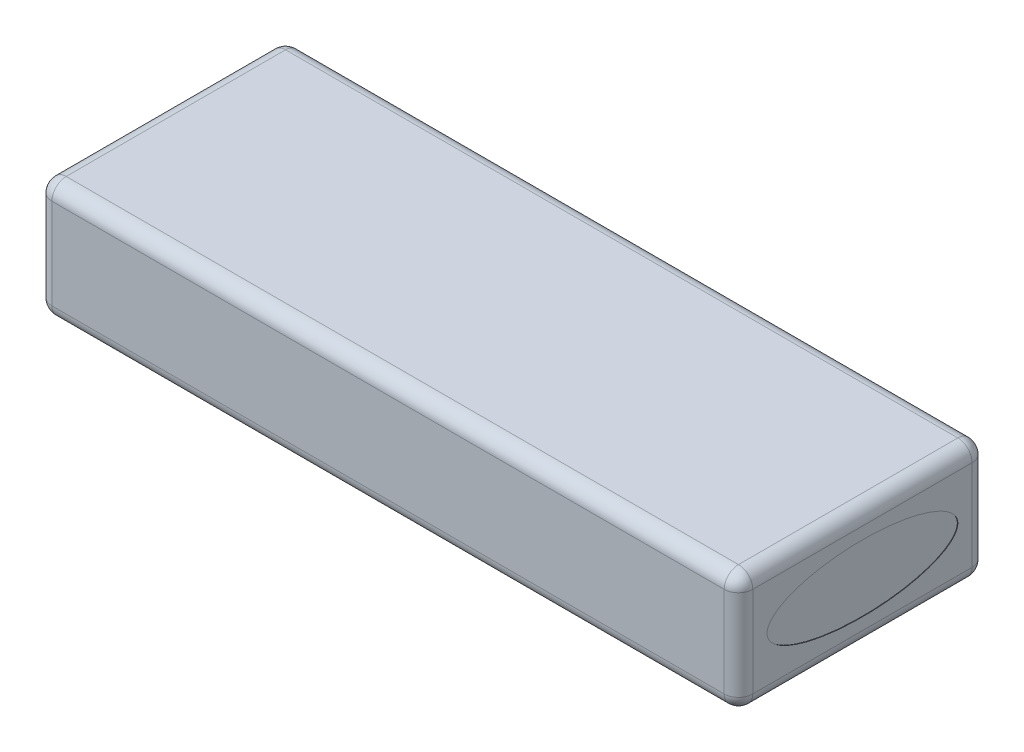
ISO-10303-21;
HEADER;
FILE_DESCRIPTION(('STEP AP214'),'2;1');
FILE_NAME('part.step','',(''),(''),'','','');
FILE_SCHEMA(('AUTOMOTIVE_DESIGN { 1 0 10303 214 1 1 1 1 }'));
ENDSEC;
DATA;
#1=APPLICATION_CONTEXT('core data for automotive mechanical design processes');
#2=APPLICATION_PROTOCOL_DEFINITION('international standard','automotive_design',2000,#1);
#3=PRODUCT_CONTEXT('',#1,'mechanical');
#4=PRODUCT('Part','Part','',(#3));
#5=PRODUCT_RELATED_PRODUCT_CATEGORY('part','',(#4));
#6=PRODUCT_DEFINITION_FORMATION('','',#4);
#7=PRODUCT_DEFINITION_CONTEXT('part definition',#1,'design');
#8=PRODUCT_DEFINITION('design','',#6,#7);
#9=PRODUCT_DEFINITION_SHAPE('','',#8);
#10=(LENGTH_UNIT() NAMED_UNIT(*) SI_UNIT(.MILLI.,.METRE.));
#11=(NAMED_UNIT(*) PLANE_ANGLE_UNIT() SI_UNIT($,.RADIAN.));
#12=(NAMED_UNIT(*) SI_UNIT($,.STERADIAN.) SOLID_ANGLE_UNIT());
#13=UNCERTAINTY_MEASURE_WITH_UNIT(LENGTH_MEASURE(1.E-05),#10,'distance_accuracy_value','');
#14=(GEOMETRIC_REPRESENTATION_CONTEXT(3) GLOBAL_UNCERTAINTY_ASSIGNED_CONTEXT((#13)) GLOBAL_UNIT_ASSIGNED_CONTEXT((#10,
#11,#12)) REPRESENTATION_CONTEXT('',''));
#15=CARTESIAN_POINT('',(0.,0.,0.));
#16=DIRECTION('',(0.,0.,1.));
#17=DIRECTION('',(1.,0.,0.));
#18=AXIS2_PLACEMENT_3D('',#15,#16,#17);
#19=CARTESIAN_POINT('',(73.5,-12.5,26.));
#20=DIRECTION('',(1.,0.,0.));
#21=DIRECTION('',(0.,0.,-1.));
#22=AXIS2_PLACEMENT_3D('',#19,#20,#21);
#23=PLANE('',#22);
#24=CARTESIAN_POINT('',(73.5,0.,0.));
#25=DIRECTION('',(1.,0.,0.));
#26=DIRECTION('',(0.,0.,-1.));
#27=AXIS2_PLACEMENT_3D('',#24,#25,#26);
#28=ELLIPSE('',#27,20.,7.);
#29=CARTESIAN_POINT('',(73.5,0.,-20.));
#30=VERTEX_POINT('',#29);
#31=EDGE_CURVE('E628',#30,#30,#28,.T.);
#32=ORIENTED_EDGE('',*,*,#31,.F.);
#33=EDGE_LOOP('',(#32));
#34=FACE_BOUND('',#33,.T.);
#35=DIRECTION('',(0.,0.,-1.));
#36=VECTOR('',#35,1.);
#37=CARTESIAN_POINT('',(73.5,9.5,23.));
#38=LINE('',#37,#36);
#39=CARTESIAN_POINT('',(73.5,9.5,-23.));
#40=VERTEX_POINT('',#39);
#41=CARTESIAN_POINT('',(73.5,9.5,23.));
#42=VERTEX_POINT('',#41);
#43=EDGE_CURVE('E45',#40,#42,#38,.F.);
#44=ORIENTED_EDGE('',*,*,#43,.T.);
#45=DIRECTION('',(0.,1.,0.));
#46=VECTOR('',#45,1.);
#47=CARTESIAN_POINT('',(73.5,-12.5,23.));
#48=LINE('',#47,#46);
#49=CARTESIAN_POINT('',(73.5,-9.5,23.));
#50=VERTEX_POINT('',#49);
#51=EDGE_CURVE('E11',#42,#50,#48,.F.);
#52=ORIENTED_EDGE('',*,*,#51,.T.);
#53=DIRECTION('',(0.,0.,-1.));
#54=VECTOR('',#53,1.);
#55=CARTESIAN_POINT('',(73.5,-9.5,26.));
#56=LINE('',#55,#54);
#57=CARTESIAN_POINT('',(73.5,-9.5,-23.));
#58=VERTEX_POINT('',#57);
#59=EDGE_CURVE('E135',#50,#58,#56,.T.);
#60=ORIENTED_EDGE('',*,*,#59,.T.);
#61=DIRECTION('',(0.,1.,0.));
#62=VECTOR('',#61,1.);
#63=CARTESIAN_POINT('',(73.5,-12.5,-23.));
#64=LINE('',#63,#62);
#65=EDGE_CURVE('E56',#58,#40,#64,.T.);
#66=ORIENTED_EDGE('',*,*,#65,.T.);
#67=EDGE_LOOP('',(#44,#52,#60,#66));
#68=FACE_BOUND('',#67,.T.);
#69=ADVANCED_FACE('F36',(#34,#68),#23,.T.);
#70=CARTESIAN_POINT('',(-73.5,-12.5,26.));
#71=DIRECTION('',(0.,0.,1.));
#72=DIRECTION('',(1.,0.,0.));
#73=AXIS2_PLACEMENT_3D('',#70,#71,#72);
#74=PLANE('',#73);
#75=DIRECTION('',(1.,0.,0.));
#76=VECTOR('',#75,1.);
#77=CARTESIAN_POINT('',(-73.5,9.5,26.));
#78=LINE('',#77,#76);
#79=CARTESIAN_POINT('',(70.5,9.5,26.));
#80=VERTEX_POINT('',#79);
#81=CARTESIAN_POINT('',(-70.5,9.5,26.));
#82=VERTEX_POINT('',#81);
#83=EDGE_CURVE('E185',#80,#82,#78,.F.);
#84=ORIENTED_EDGE('',*,*,#83,.T.);
#85=DIRECTION('',(0.,1.,0.));
#86=VECTOR('',#85,1.);
#87=CARTESIAN_POINT('',(-70.5,-12.5,26.));
#88=LINE('',#87,#86);
#89=CARTESIAN_POINT('',(-70.5,-9.5,26.));
#90=VERTEX_POINT('',#89);
#91=EDGE_CURVE('E261',#82,#90,#88,.F.);
#92=ORIENTED_EDGE('',*,*,#91,.T.);
#93=DIRECTION('',(1.,0.,0.));
#94=VECTOR('',#93,1.);
#95=CARTESIAN_POINT('',(-73.5,-9.5,26.));
#96=LINE('',#95,#94);
#97=CARTESIAN_POINT('',(70.5,-9.5,26.));
#98=VERTEX_POINT('',#97);
#99=EDGE_CURVE('E148',#90,#98,#96,.T.);
#100=ORIENTED_EDGE('',*,*,#99,.T.);
#101=DIRECTION('',(0.,1.,0.));
#102=VECTOR('',#101,1.);
#103=CARTESIAN_POINT('',(70.5,-12.5,26.));
#104=LINE('',#103,#102);
#105=EDGE_CURVE('E259',#98,#80,#104,.T.);
#106=ORIENTED_EDGE('',*,*,#105,.T.);
#107=EDGE_LOOP('',(#84,#92,#100,#106));
#108=FACE_BOUND('',#107,.T.);
#109=ADVANCED_FACE('F288',(#108),#74,.T.);
#110=CARTESIAN_POINT('',(-73.5,-12.5,26.));
#111=DIRECTION('',(-1.,0.,0.));
#112=DIRECTION('',(0.,0.,1.));
#113=AXIS2_PLACEMENT_3D('',#110,#111,#112);
#114=PLANE('',#113);
#115=CARTESIAN_POINT('',(-73.5,0.,0.));
#116=DIRECTION('',(-1.,0.,0.));
#117=DIRECTION('',(0.,0.,-1.));
#118=AXIS2_PLACEMENT_3D('',#115,#116,#117);
#119=ELLIPSE('',#118,20.,7.);
#120=CARTESIAN_POINT('',(-73.5,0.,-20.));
#121=VERTEX_POINT('',#120);
#122=EDGE_CURVE('E629',#121,#121,#119,.T.);
#123=ORIENTED_EDGE('',*,*,#122,.F.);
#124=EDGE_LOOP('',(#123));
#125=FACE_BOUND('',#124,.T.);
#126=DIRECTION('',(0.,0.,1.));
#127=VECTOR('',#126,1.);
#128=CARTESIAN_POINT('',(-73.5,9.5,-23.));
#129=LINE('',#128,#127);
#130=CARTESIAN_POINT('',(-73.5,9.5,23.));
#131=VERTEX_POINT('',#130);
#132=CARTESIAN_POINT('',(-73.5,9.5,-23.));
#133=VERTEX_POINT('',#132);
#134=EDGE_CURVE('E245',#131,#133,#129,.F.);
#135=ORIENTED_EDGE('',*,*,#134,.T.);
#136=DIRECTION('',(0.,1.,0.));
#137=VECTOR('',#136,1.);
#138=CARTESIAN_POINT('',(-73.5,-12.5,-23.));
#139=LINE('',#138,#137);
#140=CARTESIAN_POINT('',(-73.5,-9.5,-23.));
#141=VERTEX_POINT('',#140);
#142=EDGE_CURVE('E247',#133,#141,#139,.F.);
#143=ORIENTED_EDGE('',*,*,#142,.T.);
#144=DIRECTION('',(0.,0.,1.));
#145=VECTOR('',#144,1.);
#146=CARTESIAN_POINT('',(-73.5,-9.5,26.));
#147=LINE('',#146,#145);
#148=CARTESIAN_POINT('',(-73.5,-9.5,23.));
#149=VERTEX_POINT('',#148);
#150=EDGE_CURVE('E160',#141,#149,#147,.T.);
#151=ORIENTED_EDGE('',*,*,#150,.T.);
#152=DIRECTION('',(0.,1.,0.));
#153=VECTOR('',#152,1.);
#154=CARTESIAN_POINT('',(-73.5,-12.5,23.));
#155=LINE('',#154,#153);
#156=EDGE_CURVE('E243',#149,#131,#155,.T.);
#157=ORIENTED_EDGE('',*,*,#156,.T.);
#158=EDGE_LOOP('',(#135,#143,#151,#157));
#159=FACE_BOUND('',#158,.T.);
#160=ADVANCED_FACE('F294',(#125,#159),#114,.T.);
#161=CARTESIAN_POINT('',(-73.5,-12.5,-26.));
#162=DIRECTION('',(0.,0.,-1.));
#163=DIRECTION('',(-1.,0.,0.));
#164=AXIS2_PLACEMENT_3D('',#161,#162,#163);
#165=PLANE('',#164);
#166=DIRECTION('',(-1.,0.,0.));
#167=VECTOR('',#166,1.);
#168=CARTESIAN_POINT('',(-73.5,-9.5,-26.));
#169=LINE('',#168,#167);
#170=CARTESIAN_POINT('',(70.5,-9.5,-26.));
#171=VERTEX_POINT('',#170);
#172=CARTESIAN_POINT('',(-70.5,-9.5,-26.));
#173=VERTEX_POINT('',#172);
#174=EDGE_CURVE('E639',#171,#173,#169,.T.);
#175=ORIENTED_EDGE('',*,*,#174,.T.);
#176=DIRECTION('',(0.,1.,0.));
#177=VECTOR('',#176,1.);
#178=CARTESIAN_POINT('',(-70.5,-12.5,-26.));
#179=LINE('',#178,#177);
#180=CARTESIAN_POINT('',(-70.5,9.5,-26.));
#181=VERTEX_POINT('',#180);
#182=EDGE_CURVE('E240',#173,#181,#179,.T.);
#183=ORIENTED_EDGE('',*,*,#182,.T.);
#184=DIRECTION('',(-1.,0.,0.));
#185=VECTOR('',#184,1.);
#186=CARTESIAN_POINT('',(73.5,9.5,-26.));
#187=LINE('',#186,#185);
#188=CARTESIAN_POINT('',(70.5,9.5,-26.));
#189=VERTEX_POINT('',#188);
#190=EDGE_CURVE('E273',#181,#189,#187,.F.);
#191=ORIENTED_EDGE('',*,*,#190,.T.);
#192=DIRECTION('',(0.,1.,0.));
#193=VECTOR('',#192,1.);
#194=CARTESIAN_POINT('',(70.5,-12.5,-26.));
#195=LINE('',#194,#193);
#196=EDGE_CURVE('E156',#189,#171,#195,.F.);
#197=ORIENTED_EDGE('',*,*,#196,.T.);
#198=EDGE_LOOP('',(#175,#183,#191,#197));
#199=FACE_BOUND('',#198,.T.);
#200=ADVANCED_FACE('F300',(#199),#165,.T.);
#201=CARTESIAN_POINT('',(0.,-12.5,0.));
#202=DIRECTION('',(0.,-1.,0.));
#203=DIRECTION('',(0.,0.,-1.));
#204=AXIS2_PLACEMENT_3D('',#201,#202,#203);
#205=PLANE('',#204);
#206=DIRECTION('',(1.,0.,0.));
#207=VECTOR('',#206,1.);
#208=CARTESIAN_POINT('',(0.,-12.5,23.));
#209=LINE('',#208,#207);
#210=CARTESIAN_POINT('',(70.5,-12.5,23.));
#211=VERTEX_POINT('',#210);
#212=CARTESIAN_POINT('',(-70.5,-12.5,23.));
#213=VERTEX_POINT('',#212);
#214=EDGE_CURVE('E130',#211,#213,#209,.F.);
#215=ORIENTED_EDGE('',*,*,#214,.T.);
#216=DIRECTION('',(0.,0.,1.));
#217=VECTOR('',#216,1.);
#218=CARTESIAN_POINT('',(-70.5,-12.5,0.));
#219=LINE('',#218,#217);
#220=CARTESIAN_POINT('',(-70.5,-12.5,-23.));
#221=VERTEX_POINT('',#220);
#222=EDGE_CURVE('E125',#213,#221,#219,.F.);
#223=ORIENTED_EDGE('',*,*,#222,.T.);
#224=DIRECTION('',(-1.,0.,0.));
#225=VECTOR('',#224,1.);
#226=CARTESIAN_POINT('',(0.,-12.5,-23.));
#227=LINE('',#226,#225);
#228=CARTESIAN_POINT('',(70.5,-12.5,-23.));
#229=VERTEX_POINT('',#228);
#230=EDGE_CURVE('E128',#221,#229,#227,.F.);
#231=ORIENTED_EDGE('',*,*,#230,.T.);
#232=DIRECTION('',(0.,0.,-1.));
#233=VECTOR('',#232,1.);
#234=CARTESIAN_POINT('',(70.5,-12.5,0.));
#235=LINE('',#234,#233);
#236=EDGE_CURVE('E136',#229,#211,#235,.F.);
#237=ORIENTED_EDGE('',*,*,#236,.T.);
#238=EDGE_LOOP('',(#215,#223,#231,#237));
#239=FACE_BOUND('',#238,.T.);
#240=ADVANCED_FACE('F127',(#239),#205,.T.);
#241=CARTESIAN_POINT('',(0.,12.5,0.));
#242=DIRECTION('',(0.,-1.,0.));
#243=DIRECTION('',(0.,0.,-1.));
#244=AXIS2_PLACEMENT_3D('',#241,#242,#243);
#245=PLANE('',#244);
#246=DIRECTION('',(-1.,0.,0.));
#247=VECTOR('',#246,1.);
#248=CARTESIAN_POINT('',(-73.5,12.5,-23.));
#249=LINE('',#248,#247);
#250=CARTESIAN_POINT('',(70.5,12.5,-23.));
#251=VERTEX_POINT('',#250);
#252=CARTESIAN_POINT('',(-70.5,12.5,-23.));
#253=VERTEX_POINT('',#252);
#254=EDGE_CURVE('E232',#251,#253,#249,.T.);
#255=ORIENTED_EDGE('',*,*,#254,.T.);
#256=DIRECTION('',(0.,0.,1.));
#257=VECTOR('',#256,1.);
#258=CARTESIAN_POINT('',(-70.5,12.5,23.));
#259=LINE('',#258,#257);
#260=CARTESIAN_POINT('',(-70.5,12.5,23.));
#261=VERTEX_POINT('',#260);
#262=EDGE_CURVE('E254',#253,#261,#259,.T.);
#263=ORIENTED_EDGE('',*,*,#262,.T.);
#264=DIRECTION('',(1.,0.,0.));
#265=VECTOR('',#264,1.);
#266=CARTESIAN_POINT('',(73.5,12.5,23.));
#267=LINE('',#266,#265);
#268=CARTESIAN_POINT('',(70.5,12.5,23.));
#269=VERTEX_POINT('',#268);
#270=EDGE_CURVE('E235',#261,#269,#267,.T.);
#271=ORIENTED_EDGE('',*,*,#270,.T.);
#272=DIRECTION('',(0.,0.,-1.));
#273=VECTOR('',#272,1.);
#274=CARTESIAN_POINT('',(70.5,12.5,-23.));
#275=LINE('',#274,#273);
#276=EDGE_CURVE('E209',#269,#251,#275,.T.);
#277=ORIENTED_EDGE('',*,*,#276,.T.);
#278=EDGE_LOOP('',(#255,#263,#271,#277));
#279=FACE_BOUND('',#278,.T.);
#280=ADVANCED_FACE('F304',(#279),#245,.F.);
#281=CARTESIAN_POINT('',(-73.5,-9.5,23.));
#282=DIRECTION('',(1.,0.,0.));
#283=DIRECTION('',(0.,0.,-1.));
#284=AXIS2_PLACEMENT_3D('',#281,#282,#283);
#285=CYLINDRICAL_SURFACE('',#284,3.);
#286=ORIENTED_EDGE('',*,*,#99,.F.);
#287=CARTESIAN_POINT('',(-70.5,-9.5,23.));
#288=DIRECTION('',(1.,0.,0.));
#289=DIRECTION('',(0.,0.,-1.));
#290=AXIS2_PLACEMENT_3D('',#287,#288,#289);
#291=CIRCLE('',#290,3.);
#292=EDGE_CURVE('E265',#90,#213,#291,.T.);
#293=ORIENTED_EDGE('',*,*,#292,.T.);
#294=ORIENTED_EDGE('',*,*,#214,.F.);
#295=CARTESIAN_POINT('',(70.5,-9.5,23.));
#296=DIRECTION('',(1.,0.,0.));
#297=DIRECTION('',(0.,0.,-1.));
#298=AXIS2_PLACEMENT_3D('',#295,#296,#297);
#299=CIRCLE('',#298,3.);
#300=EDGE_CURVE('E263',#211,#98,#299,.F.);
#301=ORIENTED_EDGE('',*,*,#300,.T.);
#302=EDGE_LOOP('',(#286,#293,#294,#301));
#303=FACE_BOUND('',#302,.T.);
#304=ADVANCED_FACE('F270',(#303),#285,.T.);
#305=CARTESIAN_POINT('',(-73.5,-9.5,-23.));
#306=DIRECTION('',(-1.,0.,0.));
#307=DIRECTION('',(0.,0.,1.));
#308=AXIS2_PLACEMENT_3D('',#305,#306,#307);
#309=CYLINDRICAL_SURFACE('',#308,3.);
#310=ORIENTED_EDGE('',*,*,#230,.F.);
#311=CARTESIAN_POINT('',(-70.5,-9.5,-23.));
#312=DIRECTION('',(-1.,0.,0.));
#313=DIRECTION('',(0.,0.,1.));
#314=AXIS2_PLACEMENT_3D('',#311,#312,#313);
#315=CIRCLE('',#314,3.);
#316=EDGE_CURVE('E144',#221,#173,#315,.F.);
#317=ORIENTED_EDGE('',*,*,#316,.T.);
#318=ORIENTED_EDGE('',*,*,#174,.F.);
#319=CARTESIAN_POINT('',(70.5,-9.5,-23.));
#320=DIRECTION('',(-1.,0.,0.));
#321=DIRECTION('',(0.,0.,1.));
#322=AXIS2_PLACEMENT_3D('',#319,#320,#321);
#323=CIRCLE('',#322,3.);
#324=EDGE_CURVE('E147',#171,#229,#323,.T.);
#325=ORIENTED_EDGE('',*,*,#324,.T.);
#326=EDGE_LOOP('',(#310,#317,#318,#325));
#327=FACE_BOUND('',#326,.T.);
#328=ADVANCED_FACE('F142',(#327),#309,.T.);
#329=CARTESIAN_POINT('',(0.,9.5,-23.));
#330=DIRECTION('',(1.,0.,0.));
#331=DIRECTION('',(0.,0.,-1.));
#332=AXIS2_PLACEMENT_3D('',#329,#330,#331);
#333=CYLINDRICAL_SURFACE('',#332,3.);
#334=ORIENTED_EDGE('',*,*,#190,.F.);
#335=CARTESIAN_POINT('',(-70.5,9.5,-23.));
#336=DIRECTION('',(1.,0.,0.));
#337=DIRECTION('',(0.,0.,-1.));
#338=AXIS2_PLACEMENT_3D('',#335,#336,#337);
#339=CIRCLE('',#338,3.);
#340=EDGE_CURVE('E251',#181,#253,#339,.T.);
#341=ORIENTED_EDGE('',*,*,#340,.T.);
#342=ORIENTED_EDGE('',*,*,#254,.F.);
#343=CARTESIAN_POINT('',(70.5,9.5,-23.));
#344=DIRECTION('',(1.,0.,0.));
#345=DIRECTION('',(0.,0.,-1.));
#346=AXIS2_PLACEMENT_3D('',#343,#344,#345);
#347=CIRCLE('',#346,3.);
#348=EDGE_CURVE('E249',#251,#189,#347,.F.);
#349=ORIENTED_EDGE('',*,*,#348,.T.);
#350=EDGE_LOOP('',(#334,#341,#342,#349));
#351=FACE_BOUND('',#350,.T.);
#352=ADVANCED_FACE('F307',(#351),#333,.T.);
#353=CARTESIAN_POINT('',(0.,9.5,23.));
#354=DIRECTION('',(-1.,0.,0.));
#355=DIRECTION('',(0.,0.,1.));
#356=AXIS2_PLACEMENT_3D('',#353,#354,#355);
#357=CYLINDRICAL_SURFACE('',#356,3.);
#358=ORIENTED_EDGE('',*,*,#270,.F.);
#359=CARTESIAN_POINT('',(-70.5,9.5,23.));
#360=DIRECTION('',(-1.,0.,0.));
#361=DIRECTION('',(0.,0.,1.));
#362=AXIS2_PLACEMENT_3D('',#359,#360,#361);
#363=CIRCLE('',#362,3.);
#364=EDGE_CURVE('E257',#261,#82,#363,.F.);
#365=ORIENTED_EDGE('',*,*,#364,.T.);
#366=ORIENTED_EDGE('',*,*,#83,.F.);
#367=CARTESIAN_POINT('',(70.5,9.5,23.));
#368=DIRECTION('',(-1.,0.,0.));
#369=DIRECTION('',(0.,0.,1.));
#370=AXIS2_PLACEMENT_3D('',#367,#368,#369);
#371=CIRCLE('',#370,3.);
#372=EDGE_CURVE('E213',#80,#269,#371,.T.);
#373=ORIENTED_EDGE('',*,*,#372,.T.);
#374=EDGE_LOOP('',(#358,#365,#366,#373));
#375=FACE_BOUND('',#374,.T.);
#376=ADVANCED_FACE('F310',(#375),#357,.T.);
#377=CARTESIAN_POINT('',(-70.5,9.5,23.));
#378=DIRECTION('',(0.,0.,1.));
#379=DIRECTION('',(1.,0.,0.));
#380=AXIS2_PLACEMENT_3D('',#377,#378,#379);
#381=SPHERICAL_SURFACE('',#380,3.);
#382=CARTESIAN_POINT('',(-70.5,9.5,23.));
#383=DIRECTION('',(0.,-1.,0.));
#384=DIRECTION('',(0.,0.,-1.));
#385=AXIS2_PLACEMENT_3D('',#382,#383,#384);
#386=CIRCLE('',#385,3.);
#387=EDGE_CURVE('E179',#82,#131,#386,.T.);
#388=ORIENTED_EDGE('',*,*,#387,.F.);
#389=ORIENTED_EDGE('',*,*,#364,.F.);
#390=CARTESIAN_POINT('',(-70.5,9.5,23.));
#391=DIRECTION('',(0.,0.,-1.));
#392=DIRECTION('',(-1.,0.,0.));
#393=AXIS2_PLACEMENT_3D('',#390,#391,#392);
#394=CIRCLE('',#393,3.);
#395=EDGE_CURVE('E182',#131,#261,#394,.T.);
#396=ORIENTED_EDGE('',*,*,#395,.F.);
#397=EDGE_LOOP('',(#388,#389,#396));
#398=FACE_BOUND('',#397,.T.);
#399=ADVANCED_FACE('F314',(#398),#381,.T.);
#400=CARTESIAN_POINT('',(-70.5,9.5,0.));
#401=DIRECTION('',(0.,0.,-1.));
#402=DIRECTION('',(-1.,0.,0.));
#403=AXIS2_PLACEMENT_3D('',#400,#401,#402);
#404=CYLINDRICAL_SURFACE('',#403,3.);
#405=ORIENTED_EDGE('',*,*,#395,.T.);
#406=ORIENTED_EDGE('',*,*,#262,.F.);
#407=CARTESIAN_POINT('',(-70.5,9.5,-23.));
#408=DIRECTION('',(0.,0.,-1.));
#409=DIRECTION('',(-1.,0.,0.));
#410=AXIS2_PLACEMENT_3D('',#407,#408,#409);
#411=CIRCLE('',#410,3.);
#412=EDGE_CURVE('E176',#133,#253,#411,.T.);
#413=ORIENTED_EDGE('',*,*,#412,.F.);
#414=ORIENTED_EDGE('',*,*,#134,.F.);
#415=EDGE_LOOP('',(#405,#406,#413,#414));
#416=FACE_BOUND('',#415,.T.);
#417=ADVANCED_FACE('F335',(#416),#404,.T.);
#418=CARTESIAN_POINT('',(-70.5,-12.5,23.));
#419=DIRECTION('',(0.,1.,0.));
#420=DIRECTION('',(0.,0.,1.));
#421=AXIS2_PLACEMENT_3D('',#418,#419,#420);
#422=CYLINDRICAL_SURFACE('',#421,3.);
#423=ORIENTED_EDGE('',*,*,#387,.T.);
#424=ORIENTED_EDGE('',*,*,#156,.F.);
#425=CARTESIAN_POINT('',(-70.5,-9.5,23.));
#426=DIRECTION('',(0.,-1.,0.));
#427=DIRECTION('',(0.,0.,-1.));
#428=AXIS2_PLACEMENT_3D('',#425,#426,#427);
#429=CIRCLE('',#428,3.);
#430=EDGE_CURVE('E173',#90,#149,#429,.T.);
#431=ORIENTED_EDGE('',*,*,#430,.F.);
#432=ORIENTED_EDGE('',*,*,#91,.F.);
#433=EDGE_LOOP('',(#423,#424,#431,#432));
#434=FACE_BOUND('',#433,.T.);
#435=ADVANCED_FACE('F331',(#434),#422,.T.);
#436=CARTESIAN_POINT('',(-70.5,9.5,-23.));
#437=DIRECTION('',(0.,0.,1.));
#438=DIRECTION('',(1.,0.,0.));
#439=AXIS2_PLACEMENT_3D('',#436,#437,#438);
#440=SPHERICAL_SURFACE('',#439,3.);
#441=ORIENTED_EDGE('',*,*,#412,.T.);
#442=ORIENTED_EDGE('',*,*,#340,.F.);
#443=CARTESIAN_POINT('',(-70.5,9.5,-23.));
#444=DIRECTION('',(0.,-1.,0.));
#445=DIRECTION('',(0.,0.,-1.));
#446=AXIS2_PLACEMENT_3D('',#443,#444,#445);
#447=CIRCLE('',#446,3.);
#448=EDGE_CURVE('E170',#133,#181,#447,.T.);
#449=ORIENTED_EDGE('',*,*,#448,.F.);
#450=EDGE_LOOP('',(#441,#442,#449));
#451=FACE_BOUND('',#450,.T.);
#452=ADVANCED_FACE('F327',(#451),#440,.T.);
#453=CARTESIAN_POINT('',(-70.5,-9.5,23.));
#454=DIRECTION('',(0.,0.,1.));
#455=DIRECTION('',(1.,0.,0.));
#456=AXIS2_PLACEMENT_3D('',#453,#454,#455);
#457=SPHERICAL_SURFACE('',#456,3.);
#458=ORIENTED_EDGE('',*,*,#292,.F.);
#459=ORIENTED_EDGE('',*,*,#430,.T.);
#460=CARTESIAN_POINT('',(-70.5,-9.5,23.));
#461=DIRECTION('',(0.,0.,-1.));
#462=DIRECTION('',(-1.,0.,0.));
#463=AXIS2_PLACEMENT_3D('',#460,#461,#462);
#464=CIRCLE('',#463,3.);
#465=EDGE_CURVE('E163',#213,#149,#464,.T.);
#466=ORIENTED_EDGE('',*,*,#465,.F.);
#467=EDGE_LOOP('',(#458,#459,#466));
#468=FACE_BOUND('',#467,.T.);
#469=ADVANCED_FACE('F323',(#468),#457,.T.);
#470=CARTESIAN_POINT('',(-70.5,-12.5,-23.));
#471=DIRECTION('',(0.,1.,0.));
#472=DIRECTION('',(0.,0.,1.));
#473=AXIS2_PLACEMENT_3D('',#470,#471,#472);
#474=CYLINDRICAL_SURFACE('',#473,3.);
#475=ORIENTED_EDGE('',*,*,#448,.T.);
#476=ORIENTED_EDGE('',*,*,#182,.F.);
#477=CARTESIAN_POINT('',(-70.5,-9.5,-23.));
#478=DIRECTION('',(0.,-1.,0.));
#479=DIRECTION('',(0.,0.,-1.));
#480=AXIS2_PLACEMENT_3D('',#477,#478,#479);
#481=CIRCLE('',#480,3.);
#482=EDGE_CURVE('E154',#141,#173,#481,.T.);
#483=ORIENTED_EDGE('',*,*,#482,.F.);
#484=ORIENTED_EDGE('',*,*,#142,.F.);
#485=EDGE_LOOP('',(#475,#476,#483,#484));
#486=FACE_BOUND('',#485,.T.);
#487=ADVANCED_FACE('F320',(#486),#474,.T.);
#488=CARTESIAN_POINT('',(-70.5,-9.5,26.));
#489=DIRECTION('',(0.,0.,1.));
#490=DIRECTION('',(1.,0.,0.));
#491=AXIS2_PLACEMENT_3D('',#488,#489,#490);
#492=CYLINDRICAL_SURFACE('',#491,3.);
#493=ORIENTED_EDGE('',*,*,#465,.T.);
#494=ORIENTED_EDGE('',*,*,#150,.F.);
#495=CARTESIAN_POINT('',(-70.5,-9.5,-23.));
#496=DIRECTION('',(0.,0.,-1.));
#497=DIRECTION('',(-1.,0.,0.));
#498=AXIS2_PLACEMENT_3D('',#495,#496,#497);
#499=CIRCLE('',#498,3.);
#500=EDGE_CURVE('E152',#221,#141,#499,.T.);
#501=ORIENTED_EDGE('',*,*,#500,.F.);
#502=ORIENTED_EDGE('',*,*,#222,.F.);
#503=EDGE_LOOP('',(#493,#494,#501,#502));
#504=FACE_BOUND('',#503,.T.);
#505=ADVANCED_FACE('F159',(#504),#492,.T.);
#506=CARTESIAN_POINT('',(-70.5,-9.5,-23.));
#507=DIRECTION('',(0.,0.,1.));
#508=DIRECTION('',(1.,0.,0.));
#509=AXIS2_PLACEMENT_3D('',#506,#507,#508);
#510=SPHERICAL_SURFACE('',#509,3.);
#511=ORIENTED_EDGE('',*,*,#482,.T.);
#512=ORIENTED_EDGE('',*,*,#316,.F.);
#513=ORIENTED_EDGE('',*,*,#500,.T.);
#514=EDGE_LOOP('',(#511,#512,#513));
#515=FACE_BOUND('',#514,.T.);
#516=ADVANCED_FACE('F151',(#515),#510,.T.);
#517=CARTESIAN_POINT('',(70.5,9.5,23.));
#518=DIRECTION('',(0.,0.,1.));
#519=DIRECTION('',(1.,0.,0.));
#520=AXIS2_PLACEMENT_3D('',#517,#518,#519);
#521=SPHERICAL_SURFACE('',#520,3.);
#522=CARTESIAN_POINT('',(70.5,9.5,23.));
#523=DIRECTION('',(0.,0.,-1.));
#524=DIRECTION('',(-1.,0.,0.));
#525=AXIS2_PLACEMENT_3D('',#522,#523,#524);
#526=CIRCLE('',#525,3.);
#527=EDGE_CURVE('E166',#269,#42,#526,.T.);
#528=ORIENTED_EDGE('',*,*,#527,.F.);
#529=ORIENTED_EDGE('',*,*,#372,.F.);
#530=CARTESIAN_POINT('',(70.5,9.5,23.));
#531=DIRECTION('',(0.,-1.,0.));
#532=DIRECTION('',(0.,0.,-1.));
#533=AXIS2_PLACEMENT_3D('',#530,#531,#532);
#534=CIRCLE('',#533,3.);
#535=EDGE_CURVE('E40',#42,#80,#534,.T.);
#536=ORIENTED_EDGE('',*,*,#535,.F.);
#537=EDGE_LOOP('',(#528,#529,#536));
#538=FACE_BOUND('',#537,.T.);
#539=ADVANCED_FACE('F38',(#538),#521,.T.);
#540=CARTESIAN_POINT('',(70.5,-12.5,23.));
#541=DIRECTION('',(0.,1.,0.));
#542=DIRECTION('',(0.,0.,1.));
#543=AXIS2_PLACEMENT_3D('',#540,#541,#542);
#544=CYLINDRICAL_SURFACE('',#543,3.);
#545=ORIENTED_EDGE('',*,*,#535,.T.);
#546=ORIENTED_EDGE('',*,*,#105,.F.);
#547=CARTESIAN_POINT('',(70.5,-9.5,23.));
#548=DIRECTION('',(0.,-1.,0.));
#549=DIRECTION('',(0.,0.,-1.));
#550=AXIS2_PLACEMENT_3D('',#547,#548,#549);
#551=CIRCLE('',#550,3.);
#552=EDGE_CURVE('E201',#50,#98,#551,.T.);
#553=ORIENTED_EDGE('',*,*,#552,.F.);
#554=ORIENTED_EDGE('',*,*,#51,.F.);
#555=EDGE_LOOP('',(#545,#546,#553,#554));
#556=FACE_BOUND('',#555,.T.);
#557=ADVANCED_FACE('F217',(#556),#544,.T.);
#558=CARTESIAN_POINT('',(70.5,9.5,0.));
#559=DIRECTION('',(0.,0.,1.));
#560=DIRECTION('',(1.,0.,0.));
#561=AXIS2_PLACEMENT_3D('',#558,#559,#560);
#562=CYLINDRICAL_SURFACE('',#561,3.);
#563=ORIENTED_EDGE('',*,*,#527,.T.);
#564=ORIENTED_EDGE('',*,*,#43,.F.);
#565=CARTESIAN_POINT('',(70.5,9.5,-23.));
#566=DIRECTION('',(0.,0.,-1.));
#567=DIRECTION('',(-1.,0.,0.));
#568=AXIS2_PLACEMENT_3D('',#565,#566,#567);
#569=CIRCLE('',#568,3.);
#570=EDGE_CURVE('E198',#251,#40,#569,.T.);
#571=ORIENTED_EDGE('',*,*,#570,.F.);
#572=ORIENTED_EDGE('',*,*,#276,.F.);
#573=EDGE_LOOP('',(#563,#564,#571,#572));
#574=FACE_BOUND('',#573,.T.);
#575=ADVANCED_FACE('F207',(#574),#562,.T.);
#576=CARTESIAN_POINT('',(70.5,-9.5,23.));
#577=DIRECTION('',(0.,0.,1.));
#578=DIRECTION('',(1.,0.,0.));
#579=AXIS2_PLACEMENT_3D('',#576,#577,#578);
#580=SPHERICAL_SURFACE('',#579,3.);
#581=ORIENTED_EDGE('',*,*,#552,.T.);
#582=ORIENTED_EDGE('',*,*,#300,.F.);
#583=CARTESIAN_POINT('',(70.5,-9.5,23.));
#584=DIRECTION('',(0.,0.,-1.));
#585=DIRECTION('',(-1.,0.,0.));
#586=AXIS2_PLACEMENT_3D('',#583,#584,#585);
#587=CIRCLE('',#586,3.);
#588=EDGE_CURVE('E195',#50,#211,#587,.T.);
#589=ORIENTED_EDGE('',*,*,#588,.F.);
#590=EDGE_LOOP('',(#581,#582,#589));
#591=FACE_BOUND('',#590,.T.);
#592=ADVANCED_FACE('F276',(#591),#580,.T.);
#593=CARTESIAN_POINT('',(70.5,9.5,-23.));
#594=DIRECTION('',(0.,0.,1.));
#595=DIRECTION('',(1.,0.,0.));
#596=AXIS2_PLACEMENT_3D('',#593,#594,#595);
#597=SPHERICAL_SURFACE('',#596,3.);
#598=ORIENTED_EDGE('',*,*,#348,.F.);
#599=ORIENTED_EDGE('',*,*,#570,.T.);
#600=CARTESIAN_POINT('',(70.5,9.5,-23.));
#601=DIRECTION('',(0.,-1.,0.));
#602=DIRECTION('',(0.,0.,-1.));
#603=AXIS2_PLACEMENT_3D('',#600,#601,#602);
#604=CIRCLE('',#603,3.);
#605=EDGE_CURVE('E192',#189,#40,#604,.T.);
#606=ORIENTED_EDGE('',*,*,#605,.F.);
#607=EDGE_LOOP('',(#598,#599,#606));
#608=FACE_BOUND('',#607,.T.);
#609=ADVANCED_FACE('F278',(#608),#597,.T.);
#610=CARTESIAN_POINT('',(70.5,-9.5,26.));
#611=DIRECTION('',(0.,0.,-1.));
#612=DIRECTION('',(-1.,0.,0.));
#613=AXIS2_PLACEMENT_3D('',#610,#611,#612);
#614=CYLINDRICAL_SURFACE('',#613,3.);
#615=ORIENTED_EDGE('',*,*,#588,.T.);
#616=ORIENTED_EDGE('',*,*,#236,.F.);
#617=CARTESIAN_POINT('',(70.5,-9.5,-23.));
#618=DIRECTION('',(0.,0.,-1.));
#619=DIRECTION('',(-1.,0.,0.));
#620=AXIS2_PLACEMENT_3D('',#617,#618,#619);
#621=CIRCLE('',#620,3.);
#622=EDGE_CURVE('E189',#58,#229,#621,.T.);
#623=ORIENTED_EDGE('',*,*,#622,.F.);
#624=ORIENTED_EDGE('',*,*,#59,.F.);
#625=EDGE_LOOP('',(#615,#616,#623,#624));
#626=FACE_BOUND('',#625,.T.);
#627=ADVANCED_FACE('F229',(#626),#614,.T.);
#628=CARTESIAN_POINT('',(70.5,-12.5,-23.));
#629=DIRECTION('',(0.,1.,0.));
#630=DIRECTION('',(0.,0.,1.));
#631=AXIS2_PLACEMENT_3D('',#628,#629,#630);
#632=CYLINDRICAL_SURFACE('',#631,3.);
#633=ORIENTED_EDGE('',*,*,#605,.T.);
#634=ORIENTED_EDGE('',*,*,#65,.F.);
#635=CARTESIAN_POINT('',(70.5,-9.5,-23.));
#636=DIRECTION('',(0.,-1.,0.));
#637=DIRECTION('',(0.,0.,-1.));
#638=AXIS2_PLACEMENT_3D('',#635,#636,#637);
#639=CIRCLE('',#638,3.);
#640=EDGE_CURVE('E186',#171,#58,#639,.T.);
#641=ORIENTED_EDGE('',*,*,#640,.F.);
#642=ORIENTED_EDGE('',*,*,#196,.F.);
#643=EDGE_LOOP('',(#633,#634,#641,#642));
#644=FACE_BOUND('',#643,.T.);
#645=ADVANCED_FACE('F224',(#644),#632,.T.);
#646=CARTESIAN_POINT('',(70.5,-9.5,-23.));
#647=DIRECTION('',(0.,0.,1.));
#648=DIRECTION('',(1.,0.,0.));
#649=AXIS2_PLACEMENT_3D('',#646,#647,#648);
#650=SPHERICAL_SURFACE('',#649,3.);
#651=ORIENTED_EDGE('',*,*,#622,.T.);
#652=ORIENTED_EDGE('',*,*,#324,.F.);
#653=ORIENTED_EDGE('',*,*,#640,.T.);
#654=EDGE_LOOP('',(#651,#652,#653));
#655=FACE_BOUND('',#654,.T.);
#656=ADVANCED_FACE('F231',(#655),#650,.T.);
#657=CARTESIAN_POINT('',(73.4,0.,0.));
#658=DIRECTION('',(1.,0.,0.));
#659=DIRECTION('',(0.,0.,-1.));
#660=AXIS2_PLACEMENT_3D('',#657,#658,#659);
#661=ELLIPSE('',#660,20.,7.);
#662=DIRECTION('',(1.,0.,0.));
#663=VECTOR('',#662,1.);
#664=SURFACE_OF_LINEAR_EXTRUSION('',#661,#663);
#665=CARTESIAN_POINT('',(73.4,0.,-20.));
#666=VERTEX_POINT('',#665);
#667=EDGE_CURVE('E190',#666,#666,#661,.T.);
#668=ORIENTED_EDGE('',*,*,#667,.F.);
#669=EDGE_LOOP('',(#668));
#670=FACE_BOUND('',#669,.T.);
#671=ORIENTED_EDGE('',*,*,#31,.T.);
#672=EDGE_LOOP('',(#671));
#673=FACE_BOUND('',#672,.T.);
#674=ADVANCED_FACE('F345',(#670,#673),#664,.F.);
#675=CARTESIAN_POINT('',(73.4,0.,0.));
#676=DIRECTION('',(1.,0.,0.));
#677=DIRECTION('',(0.,0.,-1.));
#678=AXIS2_PLACEMENT_3D('',#675,#676,#677);
#679=PLANE('',#678);
#680=ORIENTED_EDGE('',*,*,#667,.T.);
#681=EDGE_LOOP('',(#680));
#682=FACE_BOUND('',#681,.T.);
#683=ADVANCED_FACE('F368',(#682),#679,.T.);
#684=CARTESIAN_POINT('',(-73.4,0.,0.));
#685=DIRECTION('',(-1.,0.,0.));
#686=DIRECTION('',(0.,0.,-1.));
#687=AXIS2_PLACEMENT_3D('',#684,#685,#686);
#688=ELLIPSE('',#687,20.,7.);
#689=DIRECTION('',(-1.,0.,0.));
#690=VECTOR('',#689,1.);
#691=SURFACE_OF_LINEAR_EXTRUSION('',#688,#690);
#692=CARTESIAN_POINT('',(-73.4,0.,-20.));
#693=VERTEX_POINT('',#692);
#694=EDGE_CURVE('E633',#693,#693,#688,.T.);
#695=ORIENTED_EDGE('',*,*,#694,.F.);
#696=EDGE_LOOP('',(#695));
#697=FACE_BOUND('',#696,.T.);
#698=ORIENTED_EDGE('',*,*,#122,.T.);
#699=EDGE_LOOP('',(#698));
#700=FACE_BOUND('',#699,.T.);
#701=ADVANCED_FACE('F378',(#697,#700),#691,.F.);
#702=CARTESIAN_POINT('',(-73.4,0.,0.));
#703=DIRECTION('',(-1.,0.,0.));
#704=DIRECTION('',(0.,0.,1.));
#705=AXIS2_PLACEMENT_3D('',#702,#703,#704);
#706=PLANE('',#705);
#707=ORIENTED_EDGE('',*,*,#694,.T.);
#708=EDGE_LOOP('',(#707));
#709=FACE_BOUND('',#708,.T.);
#710=ADVANCED_FACE('F386',(#709),#706,.T.);
#711=CLOSED_SHELL('',(#69,#109,#160,#200,#240,#280,#304,#328,#352,#376,#399,#417,#435,#452,#469,
#487,#505,#516,#539,#557,#575,#592,#609,#627,#645,#656,#674,#683,#701,#710));
#712=MANIFOLD_SOLID_BREP('B2',#711);
#713=ADVANCED_BREP_SHAPE_REPRESENTATION('',(#18,#712),#14);
#714=SHAPE_DEFINITION_REPRESENTATION(#9,#713);
ENDSEC;
END-ISO-10303-21;
